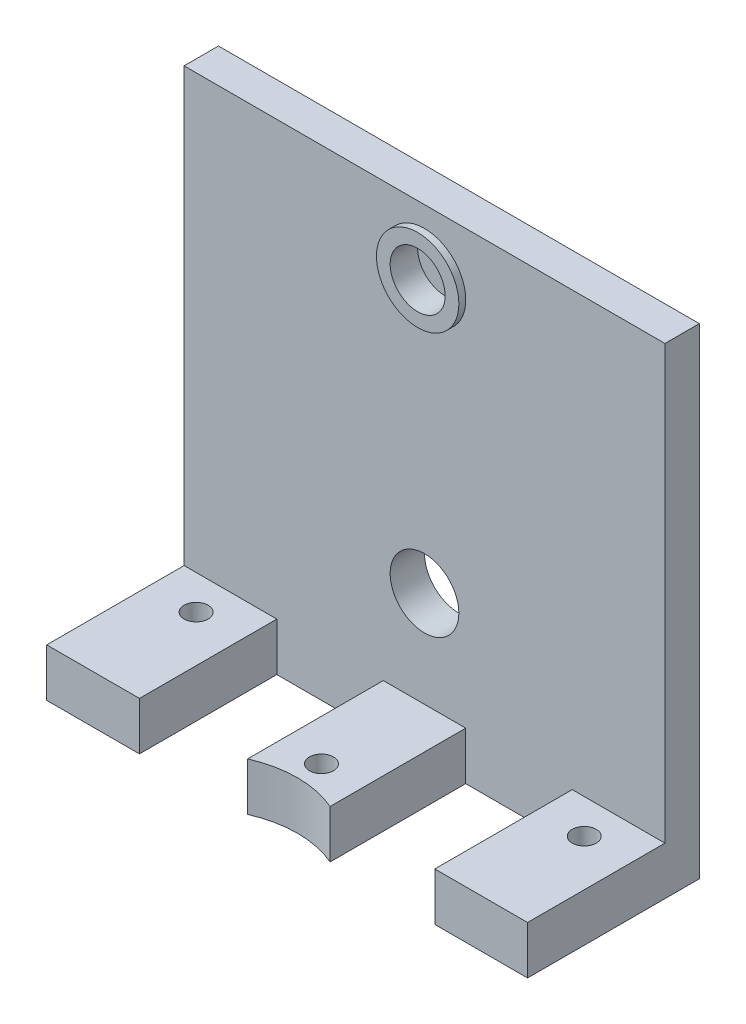
ISO-10303-21;
HEADER;
FILE_DESCRIPTION(('STEP AP214'),'2;1');
FILE_NAME('part.step','',(''),(''),'','','');
FILE_SCHEMA(('AUTOMOTIVE_DESIGN { 1 0 10303 214 1 1 1 1 }'));
ENDSEC;
DATA;
#1=APPLICATION_CONTEXT('core data for automotive mechanical design processes');
#2=APPLICATION_PROTOCOL_DEFINITION('international standard','automotive_design',2000,#1);
#3=PRODUCT_CONTEXT('',#1,'mechanical');
#4=PRODUCT('Part','Part','',(#3));
#5=PRODUCT_RELATED_PRODUCT_CATEGORY('part','',(#4));
#6=PRODUCT_DEFINITION_FORMATION('','',#4);
#7=PRODUCT_DEFINITION_CONTEXT('part definition',#1,'design');
#8=PRODUCT_DEFINITION('design','',#6,#7);
#9=PRODUCT_DEFINITION_SHAPE('','',#8);
#10=(LENGTH_UNIT() NAMED_UNIT(*) SI_UNIT(.MILLI.,.METRE.));
#11=(NAMED_UNIT(*) PLANE_ANGLE_UNIT() SI_UNIT($,.RADIAN.));
#12=(NAMED_UNIT(*) SI_UNIT($,.STERADIAN.) SOLID_ANGLE_UNIT());
#13=UNCERTAINTY_MEASURE_WITH_UNIT(LENGTH_MEASURE(1.E-05),#10,'distance_accuracy_value','');
#14=(GEOMETRIC_REPRESENTATION_CONTEXT(3) GLOBAL_UNCERTAINTY_ASSIGNED_CONTEXT((#13)) GLOBAL_UNIT_ASSIGNED_CONTEXT((#10,
#11,#12)) REPRESENTATION_CONTEXT('',''));
#15=CARTESIAN_POINT('',(0.,0.,0.));
#16=DIRECTION('',(0.,0.,1.));
#17=DIRECTION('',(1.,0.,0.));
#18=AXIS2_PLACEMENT_3D('',#15,#16,#17);
#19=CARTESIAN_POINT('',(0.,0.,5.));
#20=DIRECTION('',(0.,0.,1.));
#21=DIRECTION('',(1.,0.,0.));
#22=AXIS2_PLACEMENT_3D('',#19,#20,#21);
#23=PLANE('',#22);
#24=DIRECTION('',(-1.,0.,0.));
#25=VECTOR('',#24,1.);
#26=CARTESIAN_POINT('',(-6.,-28.,5.));
#27=LINE('',#26,#25);
#28=CARTESIAN_POINT('',(6.,-28.,5.));
#29=VERTEX_POINT('',#28);
#30=CARTESIAN_POINT('',(-6.,-28.,5.));
#31=VERTEX_POINT('',#30);
#32=EDGE_CURVE('E157',#29,#31,#27,.T.);
#33=ORIENTED_EDGE('',*,*,#32,.F.);
#34=DIRECTION('',(0.,1.,0.));
#35=VECTOR('',#34,1.);
#36=CARTESIAN_POINT('',(6.,-28.,5.));
#37=LINE('',#36,#35);
#38=CARTESIAN_POINT('',(6.,-35.,5.));
#39=VERTEX_POINT('',#38);
#40=EDGE_CURVE('E257',#39,#29,#37,.T.);
#41=ORIENTED_EDGE('',*,*,#40,.F.);
#42=DIRECTION('',(1.,0.,0.));
#43=VECTOR('',#42,1.);
#44=CARTESIAN_POINT('',(-35.,-35.,5.));
#45=LINE('',#44,#43);
#46=CARTESIAN_POINT('',(21.5,-35.,5.));
#47=VERTEX_POINT('',#46);
#48=EDGE_CURVE('E149',#39,#47,#45,.T.);
#49=ORIENTED_EDGE('',*,*,#48,.T.);
#50=DIRECTION('',(0.,-1.,0.));
#51=VECTOR('',#50,1.);
#52=CARTESIAN_POINT('',(21.5,-35.,5.));
#53=LINE('',#52,#51);
#54=CARTESIAN_POINT('',(21.5,-28.,5.));
#55=VERTEX_POINT('',#54);
#56=EDGE_CURVE('E168',#55,#47,#53,.T.);
#57=ORIENTED_EDGE('',*,*,#56,.F.);
#58=DIRECTION('',(-1.,0.,0.));
#59=VECTOR('',#58,1.);
#60=CARTESIAN_POINT('',(35.,-28.,5.));
#61=LINE('',#60,#59);
#62=CARTESIAN_POINT('',(35.,-28.,5.));
#63=VERTEX_POINT('',#62);
#64=EDGE_CURVE('E163',#63,#55,#61,.T.);
#65=ORIENTED_EDGE('',*,*,#64,.F.);
#66=DIRECTION('',(0.,1.,0.));
#67=VECTOR('',#66,1.);
#68=CARTESIAN_POINT('',(35.,35.,5.));
#69=LINE('',#68,#67);
#70=CARTESIAN_POINT('',(35.,35.,5.));
#71=VERTEX_POINT('',#70);
#72=EDGE_CURVE('E354',#63,#71,#69,.T.);
#73=ORIENTED_EDGE('',*,*,#72,.T.);
#74=DIRECTION('',(-1.,0.,0.));
#75=VECTOR('',#74,1.);
#76=CARTESIAN_POINT('',(-35.,35.,5.));
#77=LINE('',#76,#75);
#78=CARTESIAN_POINT('',(-35.,35.,5.));
#79=VERTEX_POINT('',#78);
#80=EDGE_CURVE('E388',#71,#79,#77,.T.);
#81=ORIENTED_EDGE('',*,*,#80,.T.);
#82=DIRECTION('',(0.,-1.,0.));
#83=VECTOR('',#82,1.);
#84=CARTESIAN_POINT('',(-35.,35.,5.));
#85=LINE('',#84,#83);
#86=CARTESIAN_POINT('',(-35.,-28.,5.));
#87=VERTEX_POINT('',#86);
#88=EDGE_CURVE('E214',#79,#87,#85,.T.);
#89=ORIENTED_EDGE('',*,*,#88,.T.);
#90=DIRECTION('',(-1.,0.,0.));
#91=VECTOR('',#90,1.);
#92=CARTESIAN_POINT('',(-35.,-28.,5.));
#93=LINE('',#92,#91);
#94=CARTESIAN_POINT('',(-21.5,-28.,5.));
#95=VERTEX_POINT('',#94);
#96=EDGE_CURVE('E192',#95,#87,#93,.T.);
#97=ORIENTED_EDGE('',*,*,#96,.F.);
#98=DIRECTION('',(0.,1.,0.));
#99=VECTOR('',#98,1.);
#100=CARTESIAN_POINT('',(-21.5,-35.,5.));
#101=LINE('',#100,#99);
#102=CARTESIAN_POINT('',(-21.5,-35.,5.));
#103=VERTEX_POINT('',#102);
#104=EDGE_CURVE('E187',#103,#95,#101,.T.);
#105=ORIENTED_EDGE('',*,*,#104,.F.);
#106=CARTESIAN_POINT('',(-6.,-35.,5.));
#107=VERTEX_POINT('',#106);
#108=EDGE_CURVE('E213',#103,#107,#45,.T.);
#109=ORIENTED_EDGE('',*,*,#108,.T.);
#110=DIRECTION('',(0.,-1.,0.));
#111=VECTOR('',#110,1.);
#112=CARTESIAN_POINT('',(-6.,-28.,5.));
#113=LINE('',#112,#111);
#114=EDGE_CURVE('E152',#31,#107,#113,.T.);
#115=ORIENTED_EDGE('',*,*,#114,.F.);
#116=EDGE_LOOP('',(#33,#41,#49,#57,#65,#73,#81,#89,#97,#105,#109,#115));
#117=FACE_BOUND('',#116,.T.);
#118=CARTESIAN_POINT('',(0.,-14.,5.));
#119=DIRECTION('',(0.,0.,1.));
#120=DIRECTION('',(1.,0.,0.));
#121=AXIS2_PLACEMENT_3D('',#118,#119,#120);
#122=CIRCLE('',#121,5.);
#123=CARTESIAN_POINT('',(5.,-14.,5.));
#124=VERTEX_POINT('',#123);
#125=EDGE_CURVE('E239',#124,#124,#122,.T.);
#126=ORIENTED_EDGE('',*,*,#125,.F.);
#127=EDGE_LOOP('',(#126));
#128=FACE_BOUND('',#127,.T.);
#129=CARTESIAN_POINT('',(0.,26.,5.));
#130=DIRECTION('',(0.,0.,1.));
#131=DIRECTION('',(1.,0.,0.));
#132=AXIS2_PLACEMENT_3D('',#129,#130,#131);
#133=CIRCLE('',#132,6.);
#134=CARTESIAN_POINT('',(6.,26.,5.));
#135=VERTEX_POINT('',#134);
#136=EDGE_CURVE('E282',#135,#135,#133,.T.);
#137=ORIENTED_EDGE('',*,*,#136,.F.);
#138=EDGE_LOOP('',(#137));
#139=FACE_BOUND('',#138,.T.);
#140=ADVANCED_FACE('F33',(#117,#128,#139),#23,.T.);
#141=CARTESIAN_POINT('',(0.,0.,0.));
#142=DIRECTION('',(0.,0.,1.));
#143=DIRECTION('',(1.,0.,0.));
#144=AXIS2_PLACEMENT_3D('',#141,#142,#143);
#145=PLANE('',#144);
#146=DIRECTION('',(0.,1.,0.));
#147=VECTOR('',#146,1.);
#148=CARTESIAN_POINT('',(35.,35.,0.));
#149=LINE('',#148,#147);
#150=CARTESIAN_POINT('',(35.,-35.,0.));
#151=VERTEX_POINT('',#150);
#152=CARTESIAN_POINT('',(35.,35.,0.));
#153=VERTEX_POINT('',#152);
#154=EDGE_CURVE('E220',#151,#153,#149,.T.);
#155=ORIENTED_EDGE('',*,*,#154,.F.);
#156=DIRECTION('',(1.,0.,0.));
#157=VECTOR('',#156,1.);
#158=CARTESIAN_POINT('',(-35.,-35.,0.));
#159=LINE('',#158,#157);
#160=CARTESIAN_POINT('',(-35.,-35.,0.));
#161=VERTEX_POINT('',#160);
#162=EDGE_CURVE('E352',#161,#151,#159,.T.);
#163=ORIENTED_EDGE('',*,*,#162,.F.);
#164=DIRECTION('',(0.,-1.,0.));
#165=VECTOR('',#164,1.);
#166=CARTESIAN_POINT('',(-35.,35.,0.));
#167=LINE('',#166,#165);
#168=CARTESIAN_POINT('',(-35.,35.,0.));
#169=VERTEX_POINT('',#168);
#170=EDGE_CURVE('E346',#169,#161,#167,.T.);
#171=ORIENTED_EDGE('',*,*,#170,.F.);
#172=DIRECTION('',(-1.,0.,0.));
#173=VECTOR('',#172,1.);
#174=CARTESIAN_POINT('',(-35.,35.,0.));
#175=LINE('',#174,#173);
#176=EDGE_CURVE('E337',#153,#169,#175,.T.);
#177=ORIENTED_EDGE('',*,*,#176,.F.);
#178=EDGE_LOOP('',(#155,#163,#171,#177));
#179=FACE_BOUND('',#178,.T.);
#180=CARTESIAN_POINT('',(0.,-14.,0.));
#181=DIRECTION('',(0.,0.,1.));
#182=DIRECTION('',(1.,0.,0.));
#183=AXIS2_PLACEMENT_3D('',#180,#181,#182);
#184=CIRCLE('',#183,5.);
#185=CARTESIAN_POINT('',(5.,-14.,0.));
#186=VERTEX_POINT('',#185);
#187=EDGE_CURVE('E234',#186,#186,#184,.T.);
#188=ORIENTED_EDGE('',*,*,#187,.T.);
#189=EDGE_LOOP('',(#188));
#190=FACE_BOUND('',#189,.T.);
#191=ADVANCED_FACE('F311',(#179,#190),#145,.F.);
#192=CARTESIAN_POINT('',(35.,35.,5.));
#193=DIRECTION('',(-1.,0.,0.));
#194=DIRECTION('',(0.,0.,1.));
#195=AXIS2_PLACEMENT_3D('',#192,#193,#194);
#196=PLANE('',#195);
#197=ORIENTED_EDGE('',*,*,#154,.T.);
#198=DIRECTION('',(0.,0.,-1.));
#199=VECTOR('',#198,1.);
#200=CARTESIAN_POINT('',(35.,35.,5.));
#201=LINE('',#200,#199);
#202=EDGE_CURVE('E41',#71,#153,#201,.T.);
#203=ORIENTED_EDGE('',*,*,#202,.F.);
#204=ORIENTED_EDGE('',*,*,#72,.F.);
#205=DIRECTION('',(0.,0.,-1.));
#206=VECTOR('',#205,1.);
#207=CARTESIAN_POINT('',(35.,-28.,25.));
#208=LINE('',#207,#206);
#209=CARTESIAN_POINT('',(35.,-28.,25.));
#210=VERTEX_POINT('',#209);
#211=EDGE_CURVE('E184',#210,#63,#208,.T.);
#212=ORIENTED_EDGE('',*,*,#211,.F.);
#213=DIRECTION('',(0.,1.,0.));
#214=VECTOR('',#213,1.);
#215=CARTESIAN_POINT('',(35.,-35.,25.));
#216=LINE('',#215,#214);
#217=CARTESIAN_POINT('',(35.,-35.,25.));
#218=VERTEX_POINT('',#217);
#219=EDGE_CURVE('E164',#218,#210,#216,.T.);
#220=ORIENTED_EDGE('',*,*,#219,.F.);
#221=DIRECTION('',(0.,0.,-1.));
#222=VECTOR('',#221,1.);
#223=CARTESIAN_POINT('',(35.,-35.,5.));
#224=LINE('',#223,#222);
#225=EDGE_CURVE('E227',#218,#151,#224,.T.);
#226=ORIENTED_EDGE('',*,*,#225,.T.);
#227=EDGE_LOOP('',(#197,#203,#204,#212,#220,#226));
#228=FACE_BOUND('',#227,.T.);
#229=ADVANCED_FACE('F35',(#228),#196,.F.);
#230=CARTESIAN_POINT('',(-35.,35.,5.));
#231=DIRECTION('',(0.,-1.,0.));
#232=DIRECTION('',(0.,0.,-1.));
#233=AXIS2_PLACEMENT_3D('',#230,#231,#232);
#234=PLANE('',#233);
#235=ORIENTED_EDGE('',*,*,#176,.T.);
#236=DIRECTION('',(0.,0.,-1.));
#237=VECTOR('',#236,1.);
#238=CARTESIAN_POINT('',(-35.,35.,5.));
#239=LINE('',#238,#237);
#240=EDGE_CURVE('E340',#79,#169,#239,.T.);
#241=ORIENTED_EDGE('',*,*,#240,.F.);
#242=ORIENTED_EDGE('',*,*,#80,.F.);
#243=ORIENTED_EDGE('',*,*,#202,.T.);
#244=EDGE_LOOP('',(#235,#241,#242,#243));
#245=FACE_BOUND('',#244,.T.);
#246=ADVANCED_FACE('F327',(#245),#234,.F.);
#247=CARTESIAN_POINT('',(-35.,35.,5.));
#248=DIRECTION('',(1.,0.,0.));
#249=DIRECTION('',(0.,0.,-1.));
#250=AXIS2_PLACEMENT_3D('',#247,#248,#249);
#251=PLANE('',#250);
#252=ORIENTED_EDGE('',*,*,#170,.T.);
#253=DIRECTION('',(0.,0.,-1.));
#254=VECTOR('',#253,1.);
#255=CARTESIAN_POINT('',(-35.,-35.,5.));
#256=LINE('',#255,#254);
#257=CARTESIAN_POINT('',(-35.,-35.,25.));
#258=VERTEX_POINT('',#257);
#259=EDGE_CURVE('E348',#258,#161,#256,.T.);
#260=ORIENTED_EDGE('',*,*,#259,.F.);
#261=DIRECTION('',(0.,-1.,0.));
#262=VECTOR('',#261,1.);
#263=CARTESIAN_POINT('',(-35.,-35.,25.));
#264=LINE('',#263,#262);
#265=CARTESIAN_POINT('',(-35.,-28.,25.));
#266=VERTEX_POINT('',#265);
#267=EDGE_CURVE('E188',#266,#258,#264,.T.);
#268=ORIENTED_EDGE('',*,*,#267,.F.);
#269=DIRECTION('',(0.,0.,-1.));
#270=VECTOR('',#269,1.);
#271=CARTESIAN_POINT('',(-35.,-28.,25.));
#272=LINE('',#271,#270);
#273=EDGE_CURVE('E198',#266,#87,#272,.T.);
#274=ORIENTED_EDGE('',*,*,#273,.T.);
#275=ORIENTED_EDGE('',*,*,#88,.F.);
#276=ORIENTED_EDGE('',*,*,#240,.T.);
#277=EDGE_LOOP('',(#252,#260,#268,#274,#275,#276));
#278=FACE_BOUND('',#277,.T.);
#279=ADVANCED_FACE('F324',(#278),#251,.F.);
#280=CARTESIAN_POINT('',(-35.,-35.,5.));
#281=DIRECTION('',(0.,1.,0.));
#282=DIRECTION('',(0.,0.,1.));
#283=AXIS2_PLACEMENT_3D('',#280,#281,#282);
#284=PLANE('',#283);
#285=CARTESIAN_POINT('',(0.,-35.,20.));
#286=DIRECTION('',(0.,1.,0.));
#287=DIRECTION('',(0.,0.,1.));
#288=AXIS2_PLACEMENT_3D('',#285,#286,#287);
#289=CIRCLE('',#288,1.75);
#290=CARTESIAN_POINT('',(0.,-35.,21.75));
#291=VERTEX_POINT('',#290);
#292=EDGE_CURVE('E272',#291,#291,#289,.T.);
#293=ORIENTED_EDGE('',*,*,#292,.T.);
#294=EDGE_LOOP('',(#293));
#295=FACE_BOUND('',#294,.T.);
#296=CARTESIAN_POINT('',(28.25,-35.,9.99999999999999));
#297=DIRECTION('',(0.,1.,0.));
#298=DIRECTION('',(0.,0.,1.));
#299=AXIS2_PLACEMENT_3D('',#296,#297,#298);
#300=CIRCLE('',#299,1.75);
#301=CARTESIAN_POINT('',(28.25,-35.,11.75));
#302=VERTEX_POINT('',#301);
#303=EDGE_CURVE('E266',#302,#302,#300,.T.);
#304=ORIENTED_EDGE('',*,*,#303,.T.);
#305=EDGE_LOOP('',(#304));
#306=FACE_BOUND('',#305,.T.);
#307=CARTESIAN_POINT('',(-28.25,-35.,10.));
#308=DIRECTION('',(0.,1.,0.));
#309=DIRECTION('',(0.,0.,1.));
#310=AXIS2_PLACEMENT_3D('',#307,#308,#309);
#311=CIRCLE('',#310,1.75);
#312=CARTESIAN_POINT('',(-28.25,-35.,11.75));
#313=VERTEX_POINT('',#312);
#314=EDGE_CURVE('E258',#313,#313,#311,.T.);
#315=ORIENTED_EDGE('',*,*,#314,.T.);
#316=EDGE_LOOP('',(#315));
#317=FACE_BOUND('',#316,.T.);
#318=DIRECTION('',(0.,0.,-1.));
#319=VECTOR('',#318,1.);
#320=CARTESIAN_POINT('',(6.,-35.,25.));
#321=LINE('',#320,#319);
#322=CARTESIAN_POINT('',(6.,-35.,24.7522729151325));
#323=VERTEX_POINT('',#322);
#324=EDGE_CURVE('E143',#323,#39,#321,.T.);
#325=ORIENTED_EDGE('',*,*,#324,.F.);
#326=CARTESIAN_POINT('',(0.,-35.,38.5));
#327=DIRECTION('',(0.,-1.,0.));
#328=DIRECTION('',(0.,0.,-1.));
#329=AXIS2_PLACEMENT_3D('',#326,#327,#328);
#330=CIRCLE('',#329,15.);
#331=CARTESIAN_POINT('',(-6.,-35.,24.7522729151325));
#332=VERTEX_POINT('',#331);
#333=EDGE_CURVE('E132',#332,#323,#330,.T.);
#334=ORIENTED_EDGE('',*,*,#333,.F.);
#335=DIRECTION('',(0.,0.,-1.));
#336=VECTOR('',#335,1.);
#337=CARTESIAN_POINT('',(-6.,-35.,25.));
#338=LINE('',#337,#336);
#339=EDGE_CURVE('E151',#332,#107,#338,.T.);
#340=ORIENTED_EDGE('',*,*,#339,.T.);
#341=ORIENTED_EDGE('',*,*,#108,.F.);
#342=DIRECTION('',(0.,0.,-1.));
#343=VECTOR('',#342,1.);
#344=CARTESIAN_POINT('',(-21.5,-35.,25.));
#345=LINE('',#344,#343);
#346=CARTESIAN_POINT('',(-21.5,-35.,25.));
#347=VERTEX_POINT('',#346);
#348=EDGE_CURVE('E232',#347,#103,#345,.T.);
#349=ORIENTED_EDGE('',*,*,#348,.F.);
#350=DIRECTION('',(1.,0.,0.));
#351=VECTOR('',#350,1.);
#352=CARTESIAN_POINT('',(-35.,-35.,25.));
#353=LINE('',#352,#351);
#354=EDGE_CURVE('E191',#258,#347,#353,.T.);
#355=ORIENTED_EDGE('',*,*,#354,.F.);
#356=ORIENTED_EDGE('',*,*,#259,.T.);
#357=ORIENTED_EDGE('',*,*,#162,.T.);
#358=ORIENTED_EDGE('',*,*,#225,.F.);
#359=DIRECTION('',(1.,0.,0.));
#360=VECTOR('',#359,1.);
#361=CARTESIAN_POINT('',(35.,-35.,25.));
#362=LINE('',#361,#360);
#363=CARTESIAN_POINT('',(21.5,-35.,25.));
#364=VERTEX_POINT('',#363);
#365=EDGE_CURVE('E172',#364,#218,#362,.T.);
#366=ORIENTED_EDGE('',*,*,#365,.F.);
#367=DIRECTION('',(0.,0.,-1.));
#368=VECTOR('',#367,1.);
#369=CARTESIAN_POINT('',(21.5,-35.,25.));
#370=LINE('',#369,#368);
#371=EDGE_CURVE('E175',#364,#47,#370,.T.);
#372=ORIENTED_EDGE('',*,*,#371,.T.);
#373=ORIENTED_EDGE('',*,*,#48,.F.);
#374=EDGE_LOOP('',(#325,#334,#340,#341,#349,#355,#356,#357,#358,#366,#372,#373));
#375=FACE_BOUND('',#374,.T.);
#376=ADVANCED_FACE('F147',(#295,#306,#317,#375),#284,.F.);
#377=CARTESIAN_POINT('',(0.,-14.,5.));
#378=DIRECTION('',(0.,0.,-1.));
#379=DIRECTION('',(-1.,0.,0.));
#380=AXIS2_PLACEMENT_3D('',#377,#378,#379);
#381=CYLINDRICAL_SURFACE('',#380,5.);
#382=ORIENTED_EDGE('',*,*,#125,.T.);
#383=EDGE_LOOP('',(#382));
#384=FACE_BOUND('',#383,.T.);
#385=ORIENTED_EDGE('',*,*,#187,.F.);
#386=EDGE_LOOP('',(#385));
#387=FACE_BOUND('',#386,.T.);
#388=ADVANCED_FACE('F319',(#384,#387),#381,.F.);
#389=CARTESIAN_POINT('',(-21.5,-35.,25.));
#390=DIRECTION('',(-1.,0.,0.));
#391=DIRECTION('',(0.,0.,1.));
#392=AXIS2_PLACEMENT_3D('',#389,#390,#391);
#393=PLANE('',#392);
#394=ORIENTED_EDGE('',*,*,#104,.T.);
#395=DIRECTION('',(0.,0.,-1.));
#396=VECTOR('',#395,1.);
#397=CARTESIAN_POINT('',(-21.5,-28.,25.));
#398=LINE('',#397,#396);
#399=CARTESIAN_POINT('',(-21.5,-28.,25.));
#400=VERTEX_POINT('',#399);
#401=EDGE_CURVE('E201',#400,#95,#398,.T.);
#402=ORIENTED_EDGE('',*,*,#401,.F.);
#403=DIRECTION('',(0.,1.,0.));
#404=VECTOR('',#403,1.);
#405=CARTESIAN_POINT('',(-21.5,-35.,25.));
#406=LINE('',#405,#404);
#407=EDGE_CURVE('E194',#347,#400,#406,.T.);
#408=ORIENTED_EDGE('',*,*,#407,.F.);
#409=ORIENTED_EDGE('',*,*,#348,.T.);
#410=EDGE_LOOP('',(#394,#402,#408,#409));
#411=FACE_BOUND('',#410,.T.);
#412=ADVANCED_FACE('F247',(#411),#393,.F.);
#413=CARTESIAN_POINT('',(-35.,-28.,25.));
#414=DIRECTION('',(0.,-1.,0.));
#415=DIRECTION('',(0.,0.,-1.));
#416=AXIS2_PLACEMENT_3D('',#413,#414,#415);
#417=PLANE('',#416);
#418=CARTESIAN_POINT('',(-28.25,-28.,10.));
#419=DIRECTION('',(0.,1.,0.));
#420=DIRECTION('',(0.,0.,1.));
#421=AXIS2_PLACEMENT_3D('',#418,#419,#420);
#422=CIRCLE('',#421,1.75);
#423=CARTESIAN_POINT('',(-28.25,-28.,11.75));
#424=VERTEX_POINT('',#423);
#425=EDGE_CURVE('E263',#424,#424,#422,.T.);
#426=ORIENTED_EDGE('',*,*,#425,.F.);
#427=EDGE_LOOP('',(#426));
#428=FACE_BOUND('',#427,.T.);
#429=ORIENTED_EDGE('',*,*,#96,.T.);
#430=ORIENTED_EDGE('',*,*,#273,.F.);
#431=DIRECTION('',(-1.,0.,0.));
#432=VECTOR('',#431,1.);
#433=CARTESIAN_POINT('',(-35.,-28.,25.));
#434=LINE('',#433,#432);
#435=EDGE_CURVE('E196',#400,#266,#434,.T.);
#436=ORIENTED_EDGE('',*,*,#435,.F.);
#437=ORIENTED_EDGE('',*,*,#401,.T.);
#438=EDGE_LOOP('',(#429,#430,#436,#437));
#439=FACE_BOUND('',#438,.T.);
#440=ADVANCED_FACE('F245',(#428,#439),#417,.F.);
#441=CARTESIAN_POINT('',(0.,0.,25.));
#442=DIRECTION('',(0.,0.,-1.));
#443=DIRECTION('',(-1.,0.,0.));
#444=AXIS2_PLACEMENT_3D('',#441,#442,#443);
#445=PLANE('',#444);
#446=ORIENTED_EDGE('',*,*,#267,.T.);
#447=ORIENTED_EDGE('',*,*,#354,.T.);
#448=ORIENTED_EDGE('',*,*,#407,.T.);
#449=ORIENTED_EDGE('',*,*,#435,.T.);
#450=EDGE_LOOP('',(#446,#447,#448,#449));
#451=FACE_BOUND('',#450,.T.);
#452=ADVANCED_FACE('F361',(#451),#445,.F.);
#453=CARTESIAN_POINT('',(35.,-28.,25.));
#454=DIRECTION('',(0.,-1.,0.));
#455=DIRECTION('',(0.,0.,-1.));
#456=AXIS2_PLACEMENT_3D('',#453,#454,#455);
#457=PLANE('',#456);
#458=CARTESIAN_POINT('',(28.25,-28.,9.99999999999999));
#459=DIRECTION('',(0.,1.,0.));
#460=DIRECTION('',(0.,0.,-1.));
#461=AXIS2_PLACEMENT_3D('',#458,#459,#460);
#462=CIRCLE('',#461,1.75);
#463=CARTESIAN_POINT('',(28.25,-28.,8.24999999999999));
#464=VERTEX_POINT('',#463);
#465=EDGE_CURVE('E269',#464,#464,#462,.T.);
#466=ORIENTED_EDGE('',*,*,#465,.F.);
#467=EDGE_LOOP('',(#466));
#468=FACE_BOUND('',#467,.T.);
#469=ORIENTED_EDGE('',*,*,#64,.T.);
#470=DIRECTION('',(0.,0.,-1.));
#471=VECTOR('',#470,1.);
#472=CARTESIAN_POINT('',(21.5,-28.,25.));
#473=LINE('',#472,#471);
#474=CARTESIAN_POINT('',(21.5,-28.,25.));
#475=VERTEX_POINT('',#474);
#476=EDGE_CURVE('E181',#475,#55,#473,.T.);
#477=ORIENTED_EDGE('',*,*,#476,.F.);
#478=DIRECTION('',(-1.,0.,0.));
#479=VECTOR('',#478,1.);
#480=CARTESIAN_POINT('',(35.,-28.,25.));
#481=LINE('',#480,#479);
#482=EDGE_CURVE('E167',#210,#475,#481,.T.);
#483=ORIENTED_EDGE('',*,*,#482,.F.);
#484=ORIENTED_EDGE('',*,*,#211,.T.);
#485=EDGE_LOOP('',(#469,#477,#483,#484));
#486=FACE_BOUND('',#485,.T.);
#487=ADVANCED_FACE('F363',(#468,#486),#457,.F.);
#488=CARTESIAN_POINT('',(21.5,-35.,25.));
#489=DIRECTION('',(1.,0.,0.));
#490=DIRECTION('',(0.,0.,-1.));
#491=AXIS2_PLACEMENT_3D('',#488,#489,#490);
#492=PLANE('',#491);
#493=ORIENTED_EDGE('',*,*,#56,.T.);
#494=ORIENTED_EDGE('',*,*,#371,.F.);
#495=DIRECTION('',(0.,-1.,0.));
#496=VECTOR('',#495,1.);
#497=CARTESIAN_POINT('',(21.5,-35.,25.));
#498=LINE('',#497,#496);
#499=EDGE_CURVE('E170',#475,#364,#498,.T.);
#500=ORIENTED_EDGE('',*,*,#499,.F.);
#501=ORIENTED_EDGE('',*,*,#476,.T.);
#502=EDGE_LOOP('',(#493,#494,#500,#501));
#503=FACE_BOUND('',#502,.T.);
#504=ADVANCED_FACE('F369',(#503),#492,.F.);
#505=CARTESIAN_POINT('',(0.,0.,25.));
#506=DIRECTION('',(0.,0.,1.));
#507=DIRECTION('',(1.,0.,0.));
#508=AXIS2_PLACEMENT_3D('',#505,#506,#507);
#509=PLANE('',#508);
#510=ORIENTED_EDGE('',*,*,#219,.T.);
#511=ORIENTED_EDGE('',*,*,#482,.T.);
#512=ORIENTED_EDGE('',*,*,#499,.T.);
#513=ORIENTED_EDGE('',*,*,#365,.T.);
#514=EDGE_LOOP('',(#510,#511,#512,#513));
#515=FACE_BOUND('',#514,.T.);
#516=ADVANCED_FACE('F394',(#515),#509,.T.);
#517=CARTESIAN_POINT('',(6.,-28.,25.));
#518=DIRECTION('',(-1.,0.,0.));
#519=DIRECTION('',(0.,-1.,0.));
#520=AXIS2_PLACEMENT_3D('',#517,#518,#519);
#521=PLANE('',#520);
#522=DIRECTION('',(0.,0.,-1.));
#523=VECTOR('',#522,1.);
#524=CARTESIAN_POINT('',(6.,-28.,25.));
#525=LINE('',#524,#523);
#526=CARTESIAN_POINT('',(6.,-28.,24.7522729151325));
#527=VERTEX_POINT('',#526);
#528=EDGE_CURVE('E54',#527,#29,#525,.T.);
#529=ORIENTED_EDGE('',*,*,#528,.F.);
#530=DIRECTION('',(0.,-1.,0.));
#531=VECTOR('',#530,1.);
#532=CARTESIAN_POINT('',(5.99999999999998,35.000025,24.7522729151325));
#533=LINE('',#532,#531);
#534=EDGE_CURVE('E135',#527,#323,#533,.T.);
#535=ORIENTED_EDGE('',*,*,#534,.T.);
#536=ORIENTED_EDGE('',*,*,#324,.T.);
#537=ORIENTED_EDGE('',*,*,#40,.T.);
#538=EDGE_LOOP('',(#529,#535,#536,#537));
#539=FACE_BOUND('',#538,.T.);
#540=ADVANCED_FACE('F141',(#539),#521,.F.);
#541=CARTESIAN_POINT('',(-6.,-28.,25.));
#542=DIRECTION('',(0.,-1.,0.));
#543=DIRECTION('',(0.,0.,-1.));
#544=AXIS2_PLACEMENT_3D('',#541,#542,#543);
#545=PLANE('',#544);
#546=CARTESIAN_POINT('',(0.,-28.,20.));
#547=DIRECTION('',(0.,1.,0.));
#548=DIRECTION('',(0.,0.,1.));
#549=AXIS2_PLACEMENT_3D('',#546,#547,#548);
#550=CIRCLE('',#549,1.75);
#551=CARTESIAN_POINT('',(0.,-28.,21.75));
#552=VERTEX_POINT('',#551);
#553=EDGE_CURVE('E275',#552,#552,#550,.T.);
#554=ORIENTED_EDGE('',*,*,#553,.F.);
#555=EDGE_LOOP('',(#554));
#556=FACE_BOUND('',#555,.T.);
#557=DIRECTION('',(0.,0.,-1.));
#558=VECTOR('',#557,1.);
#559=CARTESIAN_POINT('',(-6.,-28.,25.));
#560=LINE('',#559,#558);
#561=CARTESIAN_POINT('',(-6.,-28.,24.7522729151325));
#562=VERTEX_POINT('',#561);
#563=EDGE_CURVE('E154',#562,#31,#560,.T.);
#564=ORIENTED_EDGE('',*,*,#563,.F.);
#565=CARTESIAN_POINT('',(0.,-28.,38.5));
#566=DIRECTION('',(0.,-1.,0.));
#567=DIRECTION('',(0.,0.,-1.));
#568=AXIS2_PLACEMENT_3D('',#565,#566,#567);
#569=CIRCLE('',#568,15.);
#570=EDGE_CURVE('E48',#562,#527,#569,.T.);
#571=ORIENTED_EDGE('',*,*,#570,.T.);
#572=ORIENTED_EDGE('',*,*,#528,.T.);
#573=ORIENTED_EDGE('',*,*,#32,.T.);
#574=EDGE_LOOP('',(#564,#571,#572,#573));
#575=FACE_BOUND('',#574,.T.);
#576=ADVANCED_FACE('F256',(#556,#575),#545,.F.);
#577=CARTESIAN_POINT('',(-6.,-28.,25.));
#578=DIRECTION('',(1.,0.,0.));
#579=DIRECTION('',(0.,1.,0.));
#580=AXIS2_PLACEMENT_3D('',#577,#578,#579);
#581=PLANE('',#580);
#582=ORIENTED_EDGE('',*,*,#339,.F.);
#583=DIRECTION('',(0.,-1.,0.));
#584=VECTOR('',#583,1.);
#585=CARTESIAN_POINT('',(-6.00000000000001,35.000025,24.7522729151325));
#586=LINE('',#585,#584);
#587=EDGE_CURVE('E11',#332,#562,#586,.F.);
#588=ORIENTED_EDGE('',*,*,#587,.T.);
#589=ORIENTED_EDGE('',*,*,#563,.T.);
#590=ORIENTED_EDGE('',*,*,#114,.T.);
#591=EDGE_LOOP('',(#582,#588,#589,#590));
#592=FACE_BOUND('',#591,.T.);
#593=ADVANCED_FACE('F254',(#592),#581,.F.);
#594=CARTESIAN_POINT('',(-28.25,-48.,10.));
#595=DIRECTION('',(0.,1.,0.));
#596=DIRECTION('',(0.,0.,1.));
#597=AXIS2_PLACEMENT_3D('',#594,#595,#596);
#598=CYLINDRICAL_SURFACE('',#597,1.75);
#599=ORIENTED_EDGE('',*,*,#425,.T.);
#600=EDGE_LOOP('',(#599));
#601=FACE_BOUND('',#600,.T.);
#602=ORIENTED_EDGE('',*,*,#314,.F.);
#603=EDGE_LOOP('',(#602));
#604=FACE_BOUND('',#603,.T.);
#605=ADVANCED_FACE('F413',(#601,#604),#598,.F.);
#606=CARTESIAN_POINT('',(28.25,-48.,9.99999999999999));
#607=DIRECTION('',(0.,1.,0.));
#608=DIRECTION('',(0.,0.,1.));
#609=AXIS2_PLACEMENT_3D('',#606,#607,#608);
#610=CYLINDRICAL_SURFACE('',#609,1.75);
#611=ORIENTED_EDGE('',*,*,#465,.T.);
#612=EDGE_LOOP('',(#611));
#613=FACE_BOUND('',#612,.T.);
#614=ORIENTED_EDGE('',*,*,#303,.F.);
#615=EDGE_LOOP('',(#614));
#616=FACE_BOUND('',#615,.T.);
#617=ADVANCED_FACE('F306',(#613,#616),#610,.F.);
#618=CARTESIAN_POINT('',(0.,-48.,20.));
#619=DIRECTION('',(0.,1.,0.));
#620=DIRECTION('',(0.,0.,1.));
#621=AXIS2_PLACEMENT_3D('',#618,#619,#620);
#622=CYLINDRICAL_SURFACE('',#621,1.75);
#623=ORIENTED_EDGE('',*,*,#553,.T.);
#624=EDGE_LOOP('',(#623));
#625=FACE_BOUND('',#624,.T.);
#626=ORIENTED_EDGE('',*,*,#292,.F.);
#627=EDGE_LOOP('',(#626));
#628=FACE_BOUND('',#627,.T.);
#629=ADVANCED_FACE('F296',(#625,#628),#622,.F.);
#630=CARTESIAN_POINT('',(0.,26.,6.));
#631=DIRECTION('',(0.,0.,1.));
#632=DIRECTION('',(1.,0.,0.));
#633=AXIS2_PLACEMENT_3D('',#630,#631,#632);
#634=PLANE('',#633);
#635=CARTESIAN_POINT('',(0.,26.,6.));
#636=DIRECTION('',(0.,0.,1.));
#637=DIRECTION('',(1.,0.,0.));
#638=AXIS2_PLACEMENT_3D('',#635,#636,#637);
#639=CIRCLE('',#638,6.);
#640=CARTESIAN_POINT('',(6.,26.,6.));
#641=VERTEX_POINT('',#640);
#642=EDGE_CURVE('E281',#641,#641,#639,.T.);
#643=ORIENTED_EDGE('',*,*,#642,.T.);
#644=EDGE_LOOP('',(#643));
#645=FACE_BOUND('',#644,.T.);
#646=CARTESIAN_POINT('',(0.,26.,6.));
#647=DIRECTION('',(0.,0.,1.));
#648=DIRECTION('',(1.,0.,0.));
#649=AXIS2_PLACEMENT_3D('',#646,#647,#648);
#650=CIRCLE('',#649,4.);
#651=CARTESIAN_POINT('',(4.,26.,6.));
#652=VERTEX_POINT('',#651);
#653=EDGE_CURVE('E145',#652,#652,#650,.T.);
#654=ORIENTED_EDGE('',*,*,#653,.F.);
#655=EDGE_LOOP('',(#654));
#656=FACE_BOUND('',#655,.T.);
#657=ADVANCED_FACE('F293',(#645,#656),#634,.T.);
#658=CARTESIAN_POINT('',(0.,26.,6.));
#659=DIRECTION('',(0.,0.,-1.));
#660=DIRECTION('',(-1.,0.,0.));
#661=AXIS2_PLACEMENT_3D('',#658,#659,#660);
#662=CYLINDRICAL_SURFACE('',#661,6.);
#663=ORIENTED_EDGE('',*,*,#642,.F.);
#664=EDGE_LOOP('',(#663));
#665=FACE_BOUND('',#664,.T.);
#666=ORIENTED_EDGE('',*,*,#136,.T.);
#667=EDGE_LOOP('',(#666));
#668=FACE_BOUND('',#667,.T.);
#669=ADVANCED_FACE('F295',(#665,#668),#662,.T.);
#670=CARTESIAN_POINT('',(0.,26.,2.));
#671=DIRECTION('',(0.,0.,1.));
#672=DIRECTION('',(1.,0.,0.));
#673=AXIS2_PLACEMENT_3D('',#670,#671,#672);
#674=PLANE('',#673);
#675=CARTESIAN_POINT('',(0.,26.,2.));
#676=DIRECTION('',(0.,0.,1.));
#677=DIRECTION('',(1.,0.,0.));
#678=AXIS2_PLACEMENT_3D('',#675,#676,#677);
#679=CIRCLE('',#678,4.);
#680=CARTESIAN_POINT('',(4.,26.,2.));
#681=VERTEX_POINT('',#680);
#682=EDGE_CURVE('E278',#681,#681,#679,.T.);
#683=ORIENTED_EDGE('',*,*,#682,.T.);
#684=EDGE_LOOP('',(#683));
#685=FACE_BOUND('',#684,.T.);
#686=ADVANCED_FACE('F303',(#685),#674,.T.);
#687=CARTESIAN_POINT('',(0.,26.,2.));
#688=DIRECTION('',(0.,0.,1.));
#689=DIRECTION('',(1.,0.,0.));
#690=AXIS2_PLACEMENT_3D('',#687,#688,#689);
#691=CYLINDRICAL_SURFACE('',#690,4.);
#692=ORIENTED_EDGE('',*,*,#682,.F.);
#693=EDGE_LOOP('',(#692));
#694=FACE_BOUND('',#693,.T.);
#695=ORIENTED_EDGE('',*,*,#653,.T.);
#696=EDGE_LOOP('',(#695));
#697=FACE_BOUND('',#696,.T.);
#698=ADVANCED_FACE('F291',(#694,#697),#691,.F.);
#699=CARTESIAN_POINT('',(0.,35.000025,38.5));
#700=DIRECTION('',(0.,-1.,0.));
#701=DIRECTION('',(0.,0.,-1.));
#702=AXIS2_PLACEMENT_3D('',#699,#700,#701);
#703=CYLINDRICAL_SURFACE('',#702,15.);
#704=ORIENTED_EDGE('',*,*,#570,.F.);
#705=ORIENTED_EDGE('',*,*,#587,.F.);
#706=ORIENTED_EDGE('',*,*,#333,.T.);
#707=ORIENTED_EDGE('',*,*,#534,.F.);
#708=EDGE_LOOP('',(#704,#705,#706,#707));
#709=FACE_BOUND('',#708,.T.);
#710=ADVANCED_FACE('F134',(#709),#703,.F.);
#711=CLOSED_SHELL('',(#140,#191,#229,#246,#279,#376,#388,#412,#440,#452,#487,#504,#516,#540,
#576,#593,#605,#617,#629,#657,#669,#686,#698,#710));
#712=MANIFOLD_SOLID_BREP('B2',#711);
#713=ADVANCED_BREP_SHAPE_REPRESENTATION('',(#18,#712),#14);
#714=SHAPE_DEFINITION_REPRESENTATION(#9,#713);
ENDSEC;
END-ISO-10303-21;
